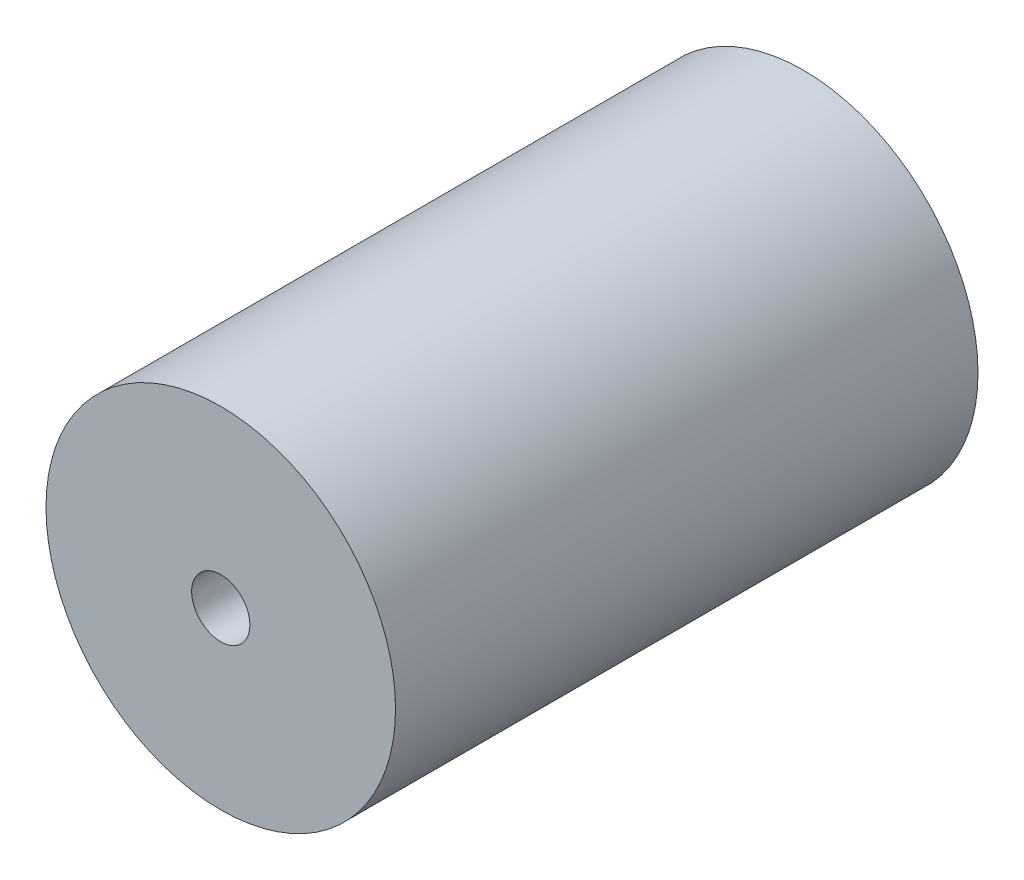
ISO-10303-21;
HEADER;
FILE_DESCRIPTION(('STEP AP214'),'2;1');
FILE_NAME('part.step','',(''),(''),'','','');
FILE_SCHEMA(('AUTOMOTIVE_DESIGN { 1 0 10303 214 1 1 1 1 }'));
ENDSEC;
DATA;
#1=APPLICATION_CONTEXT('core data for automotive mechanical design processes');
#2=APPLICATION_PROTOCOL_DEFINITION('international standard','automotive_design',2000,#1);
#3=PRODUCT_CONTEXT('',#1,'mechanical');
#4=PRODUCT('Part','Part','',(#3));
#5=PRODUCT_RELATED_PRODUCT_CATEGORY('part','',(#4));
#6=PRODUCT_DEFINITION_FORMATION('','',#4);
#7=PRODUCT_DEFINITION_CONTEXT('part definition',#1,'design');
#8=PRODUCT_DEFINITION('design','',#6,#7);
#9=PRODUCT_DEFINITION_SHAPE('','',#8);
#10=(LENGTH_UNIT() NAMED_UNIT(*) SI_UNIT(.MILLI.,.METRE.));
#11=(NAMED_UNIT(*) PLANE_ANGLE_UNIT() SI_UNIT($,.RADIAN.));
#12=(NAMED_UNIT(*) SI_UNIT($,.STERADIAN.) SOLID_ANGLE_UNIT());
#13=UNCERTAINTY_MEASURE_WITH_UNIT(LENGTH_MEASURE(1.E-05),#10,'distance_accuracy_value','');
#14=(GEOMETRIC_REPRESENTATION_CONTEXT(3) GLOBAL_UNCERTAINTY_ASSIGNED_CONTEXT((#13)) GLOBAL_UNIT_ASSIGNED_CONTEXT((#10,
#11,#12)) REPRESENTATION_CONTEXT('',''));
#15=CARTESIAN_POINT('',(0.,0.,0.));
#16=DIRECTION('',(0.,0.,1.));
#17=DIRECTION('',(1.,0.,0.));
#18=AXIS2_PLACEMENT_3D('',#15,#16,#17);
#19=CARTESIAN_POINT('',(0.,0.,-30.));
#20=DIRECTION('',(0.,0.,1.));
#21=DIRECTION('',(1.,0.,0.));
#22=AXIS2_PLACEMENT_3D('',#19,#20,#21);
#23=CYLINDRICAL_SURFACE('',#22,18.);
#24=CARTESIAN_POINT('',(0.,0.,-30.));
#25=DIRECTION('',(0.,0.,1.));
#26=DIRECTION('',(1.,0.,0.));
#27=AXIS2_PLACEMENT_3D('',#24,#25,#26);
#28=CIRCLE('',#27,18.);
#29=CARTESIAN_POINT('',(18.,0.,-30.));
#30=VERTEX_POINT('',#29);
#31=EDGE_CURVE('E10',#30,#30,#28,.T.);
#32=ORIENTED_EDGE('',*,*,#31,.T.);
#33=EDGE_LOOP('',(#32));
#34=FACE_BOUND('',#33,.T.);
#35=CARTESIAN_POINT('',(0.,0.,30.));
#36=DIRECTION('',(0.,0.,1.));
#37=DIRECTION('',(1.,0.,0.));
#38=AXIS2_PLACEMENT_3D('',#35,#36,#37);
#39=CIRCLE('',#38,18.);
#40=CARTESIAN_POINT('',(18.,0.,30.));
#41=VERTEX_POINT('',#40);
#42=EDGE_CURVE('E39',#41,#41,#39,.T.);
#43=ORIENTED_EDGE('',*,*,#42,.F.);
#44=EDGE_LOOP('',(#43));
#45=FACE_BOUND('',#44,.T.);
#46=ADVANCED_FACE('F33',(#34,#45),#23,.T.);
#47=CARTESIAN_POINT('',(0.,0.,-30.));
#48=DIRECTION('',(0.,0.,1.));
#49=DIRECTION('',(1.,0.,0.));
#50=AXIS2_PLACEMENT_3D('',#47,#48,#49);
#51=PLANE('',#50);
#52=CARTESIAN_POINT('',(0.,0.,-30.));
#53=DIRECTION('',(0.,0.,1.));
#54=DIRECTION('',(1.,0.,0.));
#55=AXIS2_PLACEMENT_3D('',#52,#53,#54);
#56=CIRCLE('',#55,3.);
#57=CARTESIAN_POINT('',(3.,0.,-30.));
#58=VERTEX_POINT('',#57);
#59=EDGE_CURVE('E43',#58,#58,#56,.T.);
#60=ORIENTED_EDGE('',*,*,#59,.T.);
#61=EDGE_LOOP('',(#60));
#62=FACE_BOUND('',#61,.T.);
#63=ORIENTED_EDGE('',*,*,#31,.F.);
#64=EDGE_LOOP('',(#63));
#65=FACE_BOUND('',#64,.T.);
#66=ADVANCED_FACE('F57',(#62,#65),#51,.F.);
#67=CARTESIAN_POINT('',(0.,0.,30.));
#68=DIRECTION('',(0.,0.,1.));
#69=DIRECTION('',(1.,0.,0.));
#70=AXIS2_PLACEMENT_3D('',#67,#68,#69);
#71=PLANE('',#70);
#72=CARTESIAN_POINT('',(0.,0.,30.));
#73=DIRECTION('',(0.,0.,1.));
#74=DIRECTION('',(1.,0.,0.));
#75=AXIS2_PLACEMENT_3D('',#72,#73,#74);
#76=CIRCLE('',#75,3.);
#77=CARTESIAN_POINT('',(3.,0.,30.));
#78=VERTEX_POINT('',#77);
#79=EDGE_CURVE('E47',#78,#78,#76,.T.);
#80=ORIENTED_EDGE('',*,*,#79,.F.);
#81=EDGE_LOOP('',(#80));
#82=FACE_BOUND('',#81,.T.);
#83=ORIENTED_EDGE('',*,*,#42,.T.);
#84=EDGE_LOOP('',(#83));
#85=FACE_BOUND('',#84,.T.);
#86=ADVANCED_FACE('F55',(#82,#85),#71,.T.);
#87=CARTESIAN_POINT('',(0.,0.,-30.));
#88=DIRECTION('',(0.,0.,1.));
#89=DIRECTION('',(1.,0.,0.));
#90=AXIS2_PLACEMENT_3D('',#87,#88,#89);
#91=CYLINDRICAL_SURFACE('',#90,3.);
#92=ORIENTED_EDGE('',*,*,#59,.F.);
#93=EDGE_LOOP('',(#92));
#94=FACE_BOUND('',#93,.T.);
#95=ORIENTED_EDGE('',*,*,#79,.T.);
#96=EDGE_LOOP('',(#95));
#97=FACE_BOUND('',#96,.T.);
#98=ADVANCED_FACE('F53',(#94,#97),#91,.F.);
#99=CLOSED_SHELL('',(#46,#66,#86,#98));
#100=MANIFOLD_SOLID_BREP('B2',#99);
#101=ADVANCED_BREP_SHAPE_REPRESENTATION('',(#18,#100),#14);
#102=SHAPE_DEFINITION_REPRESENTATION(#9,#101);
ENDSEC;
END-ISO-10303-21;
